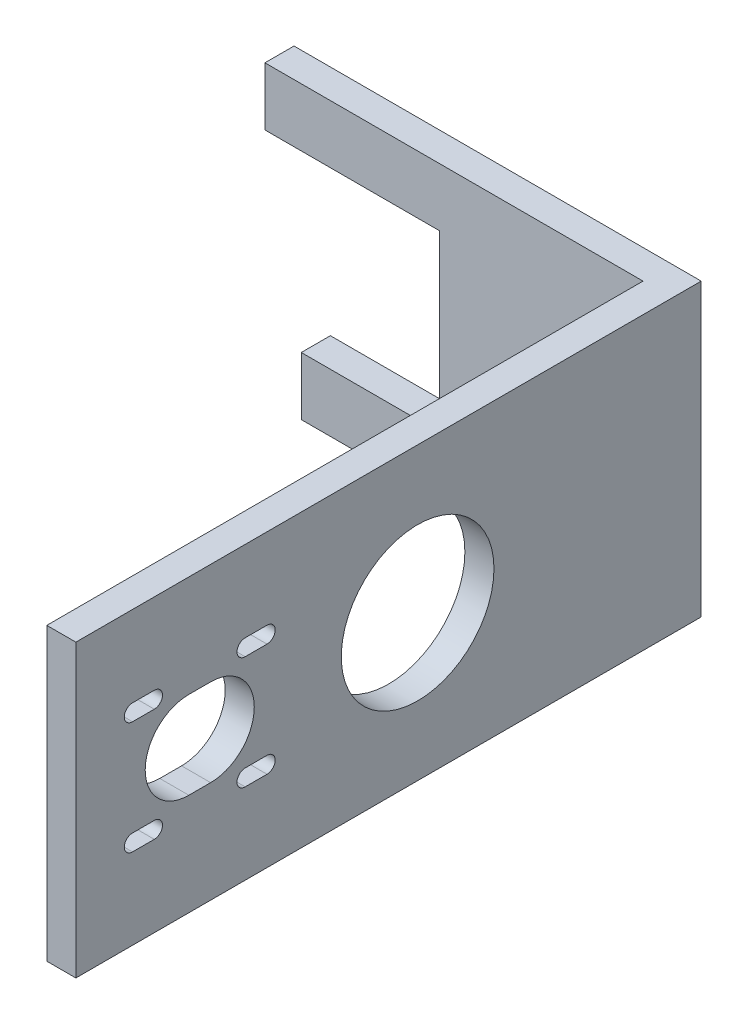
ISO-10303-21;
HEADER;
FILE_DESCRIPTION(('STEP AP214'),'2;1');
FILE_NAME('part.step','',(''),(''),'','','');
FILE_SCHEMA(('AUTOMOTIVE_DESIGN { 1 0 10303 214 1 1 1 1 }'));
ENDSEC;
DATA;
#1=APPLICATION_CONTEXT('core data for automotive mechanical design processes');
#2=APPLICATION_PROTOCOL_DEFINITION('international standard','automotive_design',2000,#1);
#3=PRODUCT_CONTEXT('',#1,'mechanical');
#4=PRODUCT('Part','Part','',(#3));
#5=PRODUCT_RELATED_PRODUCT_CATEGORY('part','',(#4));
#6=PRODUCT_DEFINITION_FORMATION('','',#4);
#7=PRODUCT_DEFINITION_CONTEXT('part definition',#1,'design');
#8=PRODUCT_DEFINITION('design','',#6,#7);
#9=PRODUCT_DEFINITION_SHAPE('','',#8);
#10=(LENGTH_UNIT() NAMED_UNIT(*) SI_UNIT(.MILLI.,.METRE.));
#11=(NAMED_UNIT(*) PLANE_ANGLE_UNIT() SI_UNIT($,.RADIAN.));
#12=(NAMED_UNIT(*) SI_UNIT($,.STERADIAN.) SOLID_ANGLE_UNIT());
#13=UNCERTAINTY_MEASURE_WITH_UNIT(LENGTH_MEASURE(1.E-05),#10,'distance_accuracy_value','');
#14=(GEOMETRIC_REPRESENTATION_CONTEXT(3) GLOBAL_UNCERTAINTY_ASSIGNED_CONTEXT((#13)) GLOBAL_UNIT_ASSIGNED_CONTEXT((#10,
#11,#12)) REPRESENTATION_CONTEXT('',''));
#15=CARTESIAN_POINT('',(0.,0.,0.));
#16=DIRECTION('',(0.,0.,1.));
#17=DIRECTION('',(1.,0.,0.));
#18=AXIS2_PLACEMENT_3D('',#15,#16,#17);
#19=CARTESIAN_POINT('',(0.,80.,0.002300000000105));
#20=DIRECTION('',(0.,0.,1.));
#21=DIRECTION('',(1.,0.,0.));
#22=AXIS2_PLACEMENT_3D('',#19,#20,#21);
#23=PLANE('',#22);
#24=CARTESIAN_POINT('',(95.,40.,0.002299999999991));
#25=DIRECTION('',(0.,0.,1.));
#26=DIRECTION('',(1.,0.,0.));
#27=AXIS2_PLACEMENT_3D('',#24,#25,#26);
#28=CIRCLE('',#27,3.3);
#29=CARTESIAN_POINT('',(98.3,40.,0.002299999999991));
#30=VERTEX_POINT('',#29);
#31=EDGE_CURVE('E335',#30,#30,#28,.T.);
#32=ORIENTED_EDGE('',*,*,#31,.T.);
#33=EDGE_LOOP('',(#32));
#34=FACE_BOUND('',#33,.T.);
#35=CARTESIAN_POINT('',(70.,40.,0.002299999999991));
#36=DIRECTION('',(0.,0.,1.));
#37=DIRECTION('',(1.,0.,0.));
#38=AXIS2_PLACEMENT_3D('',#35,#36,#37);
#39=CIRCLE('',#38,3.3);
#40=CARTESIAN_POINT('',(73.3,40.,0.002299999999991));
#41=VERTEX_POINT('',#40);
#42=EDGE_CURVE('E19',#41,#41,#39,.T.);
#43=ORIENTED_EDGE('',*,*,#42,.T.);
#44=EDGE_LOOP('',(#43));
#45=FACE_BOUND('',#44,.T.);
#46=DIRECTION('',(1.,0.,0.));
#47=VECTOR('',#46,1.);
#48=CARTESIAN_POINT('',(0.,16.,0.002299999999991));
#49=LINE('',#48,#47);
#50=CARTESIAN_POINT('',(10.,16.,0.002300000000048));
#51=VERTEX_POINT('',#50);
#52=CARTESIAN_POINT('',(48.,16.,0.002300000000048));
#53=VERTEX_POINT('',#52);
#54=EDGE_CURVE('E359',#51,#53,#49,.T.);
#55=ORIENTED_EDGE('',*,*,#54,.T.);
#56=DIRECTION('',(0.,1.,0.));
#57=VECTOR('',#56,1.);
#58=CARTESIAN_POINT('',(48.,64.,0.002299999999991));
#59=LINE('',#58,#57);
#60=CARTESIAN_POINT('',(48.,64.,0.002300000000048));
#61=VERTEX_POINT('',#60);
#62=EDGE_CURVE('E235',#53,#61,#59,.T.);
#63=ORIENTED_EDGE('',*,*,#62,.T.);
#64=DIRECTION('',(1.,0.,0.));
#65=VECTOR('',#64,1.);
#66=CARTESIAN_POINT('',(0.,64.,0.002299999999991));
#67=LINE('',#66,#65);
#68=CARTESIAN_POINT('',(0.,64.,0.0023000000000195));
#69=VERTEX_POINT('',#68);
#70=EDGE_CURVE('E213',#69,#61,#67,.T.);
#71=ORIENTED_EDGE('',*,*,#70,.F.);
#72=DIRECTION('',(0.,1.,0.));
#73=VECTOR('',#72,1.);
#74=CARTESIAN_POINT('',(0.,80.,0.002299999999991));
#75=LINE('',#74,#73);
#76=CARTESIAN_POINT('',(0.,80.,0.0023000000000195));
#77=VERTEX_POINT('',#76);
#78=EDGE_CURVE('E219',#69,#77,#75,.T.);
#79=ORIENTED_EDGE('',*,*,#78,.T.);
#80=DIRECTION('',(1.,0.,0.));
#81=VECTOR('',#80,1.);
#82=CARTESIAN_POINT('',(0.,80.,0.002299999999991));
#83=LINE('',#82,#81);
#84=CARTESIAN_POINT('',(112.,80.,0.002300000000048));
#85=VERTEX_POINT('',#84);
#86=EDGE_CURVE('E339',#77,#85,#83,.T.);
#87=ORIENTED_EDGE('',*,*,#86,.T.);
#88=DIRECTION('',(0.,1.,0.));
#89=VECTOR('',#88,1.);
#90=CARTESIAN_POINT('',(112.,80.,0.002299999999991));
#91=LINE('',#90,#89);
#92=CARTESIAN_POINT('',(112.,0.,0.002300000000048));
#93=VERTEX_POINT('',#92);
#94=EDGE_CURVE('E228',#93,#85,#91,.T.);
#95=ORIENTED_EDGE('',*,*,#94,.F.);
#96=DIRECTION('',(1.,0.,0.));
#97=VECTOR('',#96,1.);
#98=CARTESIAN_POINT('',(0.,0.,0.002299999999991));
#99=LINE('',#98,#97);
#100=CARTESIAN_POINT('',(10.,0.,0.0023000000000195));
#101=VERTEX_POINT('',#100);
#102=EDGE_CURVE('E378',#101,#93,#99,.T.);
#103=ORIENTED_EDGE('',*,*,#102,.F.);
#104=DIRECTION('',(0.,1.,0.));
#105=VECTOR('',#104,1.);
#106=CARTESIAN_POINT('',(10.,16.,0.002299999999991));
#107=LINE('',#106,#105);
#108=EDGE_CURVE('E346',#101,#51,#107,.T.);
#109=ORIENTED_EDGE('',*,*,#108,.T.);
#110=EDGE_LOOP('',(#55,#63,#71,#79,#87,#95,#103,#109));
#111=FACE_BOUND('',#110,.T.);
#112=ADVANCED_FACE('F16',(#34,#45,#111),#23,.F.);
#113=CARTESIAN_POINT('',(0.,80.,0.002300000000105));
#114=DIRECTION('',(1.,0.,0.));
#115=DIRECTION('',(0.,0.,-1.));
#116=AXIS2_PLACEMENT_3D('',#113,#114,#115);
#117=PLANE('',#116);
#118=DIRECTION('',(0.,1.,0.));
#119=VECTOR('',#118,1.);
#120=CARTESIAN_POINT('',(0.,80.,8.0023));
#121=LINE('',#120,#119);
#122=CARTESIAN_POINT('',(0.,80.,8.0023));
#123=VERTEX_POINT('',#122);
#124=CARTESIAN_POINT('',(0.,64.,8.0023));
#125=VERTEX_POINT('',#124);
#126=EDGE_CURVE('E370',#123,#125,#121,.F.);
#127=ORIENTED_EDGE('',*,*,#126,.F.);
#128=DIRECTION('',(0.,0.,-1.));
#129=VECTOR('',#128,1.);
#130=CARTESIAN_POINT('',(0.,80.,0.002300000000105));
#131=LINE('',#130,#129);
#132=EDGE_CURVE('E224',#123,#77,#131,.T.);
#133=ORIENTED_EDGE('',*,*,#132,.T.);
#134=ORIENTED_EDGE('',*,*,#78,.F.);
#135=DIRECTION('',(0.,0.,-1.));
#136=VECTOR('',#135,1.);
#137=CARTESIAN_POINT('',(0.,64.,0.002300000000105));
#138=LINE('',#137,#136);
#139=EDGE_CURVE('E222',#125,#69,#138,.T.);
#140=ORIENTED_EDGE('',*,*,#139,.F.);
#141=EDGE_LOOP('',(#127,#133,#134,#140));
#142=FACE_BOUND('',#141,.T.);
#143=ADVANCED_FACE('F221',(#142),#117,.F.);
#144=CARTESIAN_POINT('',(0.,64.,0.002300000000105));
#145=DIRECTION('',(0.,-1.,0.));
#146=DIRECTION('',(0.,0.,-1.));
#147=AXIS2_PLACEMENT_3D('',#144,#145,#146);
#148=PLANE('',#147);
#149=DIRECTION('',(0.,0.,-1.));
#150=VECTOR('',#149,1.);
#151=CARTESIAN_POINT('',(48.,64.,0.002300000000105));
#152=LINE('',#151,#150);
#153=CARTESIAN_POINT('',(48.,64.,8.0023));
#154=VERTEX_POINT('',#153);
#155=EDGE_CURVE('E237',#61,#154,#152,.F.);
#156=ORIENTED_EDGE('',*,*,#155,.T.);
#157=DIRECTION('',(1.,0.,0.));
#158=VECTOR('',#157,1.);
#159=CARTESIAN_POINT('',(0.,64.,8.0023));
#160=LINE('',#159,#158);
#161=EDGE_CURVE('E231',#125,#154,#160,.T.);
#162=ORIENTED_EDGE('',*,*,#161,.F.);
#163=ORIENTED_EDGE('',*,*,#139,.T.);
#164=ORIENTED_EDGE('',*,*,#70,.T.);
#165=EDGE_LOOP('',(#156,#162,#163,#164));
#166=FACE_BOUND('',#165,.T.);
#167=ADVANCED_FACE('F230',(#166),#148,.T.);
#168=CARTESIAN_POINT('',(48.,64.,0.002300000000105));
#169=DIRECTION('',(1.,0.,0.));
#170=DIRECTION('',(0.,0.,-1.));
#171=AXIS2_PLACEMENT_3D('',#168,#169,#170);
#172=PLANE('',#171);
#173=DIRECTION('',(0.,1.,0.));
#174=VECTOR('',#173,1.);
#175=CARTESIAN_POINT('',(48.,80.,8.0023));
#176=LINE('',#175,#174);
#177=CARTESIAN_POINT('',(48.,16.,8.0023));
#178=VERTEX_POINT('',#177);
#179=EDGE_CURVE('E362',#154,#178,#176,.F.);
#180=ORIENTED_EDGE('',*,*,#179,.F.);
#181=ORIENTED_EDGE('',*,*,#155,.F.);
#182=ORIENTED_EDGE('',*,*,#62,.F.);
#183=DIRECTION('',(0.,0.,-1.));
#184=VECTOR('',#183,1.);
#185=CARTESIAN_POINT('',(48.,16.,0.002300000000105));
#186=LINE('',#185,#184);
#187=EDGE_CURVE('E353',#53,#178,#186,.F.);
#188=ORIENTED_EDGE('',*,*,#187,.T.);
#189=EDGE_LOOP('',(#180,#181,#182,#188));
#190=FACE_BOUND('',#189,.T.);
#191=ADVANCED_FACE('F363',(#190),#172,.F.);
#192=CARTESIAN_POINT('',(0.,16.,0.002300000000105));
#193=DIRECTION('',(0.,-1.,0.));
#194=DIRECTION('',(0.,0.,-1.));
#195=AXIS2_PLACEMENT_3D('',#192,#193,#194);
#196=PLANE('',#195);
#197=ORIENTED_EDGE('',*,*,#187,.F.);
#198=ORIENTED_EDGE('',*,*,#54,.F.);
#199=DIRECTION('',(0.,0.,-1.));
#200=VECTOR('',#199,1.);
#201=CARTESIAN_POINT('',(10.,16.,0.002300000000105));
#202=LINE('',#201,#200);
#203=CARTESIAN_POINT('',(10.,16.,8.0023));
#204=VERTEX_POINT('',#203);
#205=EDGE_CURVE('E342',#51,#204,#202,.F.);
#206=ORIENTED_EDGE('',*,*,#205,.T.);
#207=DIRECTION('',(1.,0.,0.));
#208=VECTOR('',#207,1.);
#209=CARTESIAN_POINT('',(0.,16.,8.0023));
#210=LINE('',#209,#208);
#211=EDGE_CURVE('E366',#178,#204,#210,.F.);
#212=ORIENTED_EDGE('',*,*,#211,.F.);
#213=EDGE_LOOP('',(#197,#198,#206,#212));
#214=FACE_BOUND('',#213,.T.);
#215=ADVANCED_FACE('F620',(#214),#196,.F.);
#216=CARTESIAN_POINT('',(10.,16.,0.002300000000105));
#217=DIRECTION('',(1.,0.,0.));
#218=DIRECTION('',(0.,0.,-1.));
#219=AXIS2_PLACEMENT_3D('',#216,#217,#218);
#220=PLANE('',#219);
#221=DIRECTION('',(0.,1.,0.));
#222=VECTOR('',#221,1.);
#223=CARTESIAN_POINT('',(10.,80.,8.0023));
#224=LINE('',#223,#222);
#225=CARTESIAN_POINT('',(10.,0.,8.0023));
#226=VERTEX_POINT('',#225);
#227=EDGE_CURVE('E368',#204,#226,#224,.F.);
#228=ORIENTED_EDGE('',*,*,#227,.F.);
#229=ORIENTED_EDGE('',*,*,#205,.F.);
#230=ORIENTED_EDGE('',*,*,#108,.F.);
#231=DIRECTION('',(0.,0.,-1.));
#232=VECTOR('',#231,1.);
#233=CARTESIAN_POINT('',(10.,0.,0.002300000000105));
#234=LINE('',#233,#232);
#235=EDGE_CURVE('E401',#226,#101,#234,.T.);
#236=ORIENTED_EDGE('',*,*,#235,.F.);
#237=EDGE_LOOP('',(#228,#229,#230,#236));
#238=FACE_BOUND('',#237,.T.);
#239=ADVANCED_FACE('F423',(#238),#220,.F.);
#240=CARTESIAN_POINT('',(70.,40.,0.002300000000105));
#241=DIRECTION('',(0.,0.,1.));
#242=DIRECTION('',(1.,0.,0.));
#243=AXIS2_PLACEMENT_3D('',#240,#241,#242);
#244=CYLINDRICAL_SURFACE('',#243,3.3);
#245=ORIENTED_EDGE('',*,*,#42,.F.);
#246=EDGE_LOOP('',(#245));
#247=FACE_BOUND('',#246,.T.);
#248=CARTESIAN_POINT('',(70.,40.,8.0023));
#249=DIRECTION('',(0.,0.,1.));
#250=DIRECTION('',(1.,0.,0.));
#251=AXIS2_PLACEMENT_3D('',#248,#249,#250);
#252=CIRCLE('',#251,3.3);
#253=CARTESIAN_POINT('',(73.3,40.,8.0023));
#254=VERTEX_POINT('',#253);
#255=EDGE_CURVE('E332',#254,#254,#252,.F.);
#256=ORIENTED_EDGE('',*,*,#255,.F.);
#257=EDGE_LOOP('',(#256));
#258=FACE_BOUND('',#257,.T.);
#259=ADVANCED_FACE('F613',(#247,#258),#244,.F.);
#260=CARTESIAN_POINT('',(95.,40.,0.002300000000105));
#261=DIRECTION('',(0.,0.,1.));
#262=DIRECTION('',(1.,0.,0.));
#263=AXIS2_PLACEMENT_3D('',#260,#261,#262);
#264=CYLINDRICAL_SURFACE('',#263,3.3);
#265=ORIENTED_EDGE('',*,*,#31,.F.);
#266=EDGE_LOOP('',(#265));
#267=FACE_BOUND('',#266,.T.);
#268=CARTESIAN_POINT('',(95.,40.,8.0023));
#269=DIRECTION('',(0.,0.,1.));
#270=DIRECTION('',(1.,0.,0.));
#271=AXIS2_PLACEMENT_3D('',#268,#269,#270);
#272=CIRCLE('',#271,3.3);
#273=CARTESIAN_POINT('',(98.3,40.,8.0023));
#274=VERTEX_POINT('',#273);
#275=EDGE_CURVE('E328',#274,#274,#272,.F.);
#276=ORIENTED_EDGE('',*,*,#275,.F.);
#277=EDGE_LOOP('',(#276));
#278=FACE_BOUND('',#277,.T.);
#279=ADVANCED_FACE('F609',(#267,#278),#264,.F.);
#280=CARTESIAN_POINT('',(112.,80.,8.0023));
#281=DIRECTION('',(1.,0.,0.));
#282=DIRECTION('',(0.,0.,-1.));
#283=AXIS2_PLACEMENT_3D('',#280,#281,#282);
#284=PLANE('',#283);
#285=DIRECTION('',(0.,0.,-1.));
#286=VECTOR('',#285,1.);
#287=CARTESIAN_POINT('',(112.,22.25,156.43254977401));
#288=LINE('',#287,#286);
#289=CARTESIAN_POINT('',(112.,22.25,150.43254977401));
#290=VERTEX_POINT('',#289);
#291=CARTESIAN_POINT('',(112.,22.25,156.43254977401));
#292=VERTEX_POINT('',#291);
#293=EDGE_CURVE('E379',#290,#292,#288,.F.);
#294=ORIENTED_EDGE('',*,*,#293,.T.);
#295=CARTESIAN_POINT('',(112.,24.5,156.43254977401));
#296=DIRECTION('',(1.,0.,0.));
#297=DIRECTION('',(0.,0.,-1.));
#298=AXIS2_PLACEMENT_3D('',#295,#296,#297);
#299=CIRCLE('',#298,2.25);
#300=CARTESIAN_POINT('',(112.,26.75,156.43254977401));
#301=VERTEX_POINT('',#300);
#302=EDGE_CURVE('E282',#292,#301,#299,.F.);
#303=ORIENTED_EDGE('',*,*,#302,.T.);
#304=DIRECTION('',(0.,0.,1.));
#305=VECTOR('',#304,1.);
#306=CARTESIAN_POINT('',(112.,26.75,150.43254977401));
#307=LINE('',#306,#305);
#308=CARTESIAN_POINT('',(112.,26.75,150.43254977401));
#309=VERTEX_POINT('',#308);
#310=EDGE_CURVE('E293',#301,#309,#307,.F.);
#311=ORIENTED_EDGE('',*,*,#310,.T.);
#312=CARTESIAN_POINT('',(112.,24.5,150.43254977401));
#313=DIRECTION('',(1.,0.,0.));
#314=DIRECTION('',(0.,0.,-1.));
#315=AXIS2_PLACEMENT_3D('',#312,#313,#314);
#316=CIRCLE('',#315,2.25);
#317=EDGE_CURVE('E286',#309,#290,#316,.F.);
#318=ORIENTED_EDGE('',*,*,#317,.T.);
#319=EDGE_LOOP('',(#294,#303,#311,#318));
#320=FACE_BOUND('',#319,.T.);
#321=DIRECTION('',(0.,0.,-1.));
#322=VECTOR('',#321,1.);
#323=CARTESIAN_POINT('',(112.,22.25,125.43254977401));
#324=LINE('',#323,#322);
#325=CARTESIAN_POINT('',(112.,22.25,119.43254977401));
#326=VERTEX_POINT('',#325);
#327=CARTESIAN_POINT('',(112.,22.25,125.43254977401));
#328=VERTEX_POINT('',#327);
#329=EDGE_CURVE('E383',#326,#328,#324,.F.);
#330=ORIENTED_EDGE('',*,*,#329,.T.);
#331=CARTESIAN_POINT('',(112.,24.5,125.43254977401));
#332=DIRECTION('',(1.,0.,0.));
#333=DIRECTION('',(0.,0.,-1.));
#334=AXIS2_PLACEMENT_3D('',#331,#332,#333);
#335=CIRCLE('',#334,2.25);
#336=CARTESIAN_POINT('',(112.,26.75,125.43254977401));
#337=VERTEX_POINT('',#336);
#338=EDGE_CURVE('E290',#328,#337,#335,.F.);
#339=ORIENTED_EDGE('',*,*,#338,.T.);
#340=DIRECTION('',(0.,0.,1.));
#341=VECTOR('',#340,1.);
#342=CARTESIAN_POINT('',(112.,26.75,119.43254977401));
#343=LINE('',#342,#341);
#344=CARTESIAN_POINT('',(112.,26.75,119.43254977401));
#345=VERTEX_POINT('',#344);
#346=EDGE_CURVE('E302',#337,#345,#343,.F.);
#347=ORIENTED_EDGE('',*,*,#346,.T.);
#348=CARTESIAN_POINT('',(112.,24.5,119.43254977401));
#349=DIRECTION('',(1.,0.,0.));
#350=DIRECTION('',(0.,0.,-1.));
#351=AXIS2_PLACEMENT_3D('',#348,#349,#350);
#352=CIRCLE('',#351,2.25);
#353=EDGE_CURVE('E295',#345,#326,#352,.F.);
#354=ORIENTED_EDGE('',*,*,#353,.T.);
#355=EDGE_LOOP('',(#330,#339,#347,#354));
#356=FACE_BOUND('',#355,.T.);
#357=DIRECTION('',(0.,0.,-1.));
#358=VECTOR('',#357,1.);
#359=CARTESIAN_POINT('',(112.,28.,140.93254977401));
#360=LINE('',#359,#358);
#361=CARTESIAN_POINT('',(112.,28.,134.93254977401));
#362=VERTEX_POINT('',#361);
#363=CARTESIAN_POINT('',(112.,28.,140.93254977401));
#364=VERTEX_POINT('',#363);
#365=EDGE_CURVE('E387',#362,#364,#360,.F.);
#366=ORIENTED_EDGE('',*,*,#365,.T.);
#367=CARTESIAN_POINT('',(112.,40.,140.93254977401));
#368=DIRECTION('',(1.,0.,0.));
#369=DIRECTION('',(0.,0.,-1.));
#370=AXIS2_PLACEMENT_3D('',#367,#368,#369);
#371=CIRCLE('',#370,12.);
#372=CARTESIAN_POINT('',(112.,52.,140.93254977401));
#373=VERTEX_POINT('',#372);
#374=EDGE_CURVE('E299',#364,#373,#371,.F.);
#375=ORIENTED_EDGE('',*,*,#374,.T.);
#376=DIRECTION('',(0.,0.,1.));
#377=VECTOR('',#376,1.);
#378=CARTESIAN_POINT('',(112.,52.,134.93254977401));
#379=LINE('',#378,#377);
#380=CARTESIAN_POINT('',(112.,52.,134.93254977401));
#381=VERTEX_POINT('',#380);
#382=EDGE_CURVE('E311',#373,#381,#379,.F.);
#383=ORIENTED_EDGE('',*,*,#382,.T.);
#384=CARTESIAN_POINT('',(112.,40.,134.93254977401));
#385=DIRECTION('',(1.,0.,0.));
#386=DIRECTION('',(0.,0.,-1.));
#387=AXIS2_PLACEMENT_3D('',#384,#385,#386);
#388=CIRCLE('',#387,12.);
#389=EDGE_CURVE('E304',#381,#362,#388,.F.);
#390=ORIENTED_EDGE('',*,*,#389,.T.);
#391=EDGE_LOOP('',(#366,#375,#383,#390));
#392=FACE_BOUND('',#391,.T.);
#393=CARTESIAN_POINT('',(112.,40.,78.0023));
#394=DIRECTION('',(1.,0.,0.));
#395=DIRECTION('',(0.,0.,-1.));
#396=AXIS2_PLACEMENT_3D('',#393,#394,#395);
#397=CIRCLE('',#396,21.);
#398=CARTESIAN_POINT('',(112.,40.,57.0023));
#399=VERTEX_POINT('',#398);
#400=EDGE_CURVE('E308',#399,#399,#397,.F.);
#401=ORIENTED_EDGE('',*,*,#400,.T.);
#402=EDGE_LOOP('',(#401));
#403=FACE_BOUND('',#402,.T.);
#404=DIRECTION('',(0.,0.,-1.));
#405=VECTOR('',#404,1.);
#406=CARTESIAN_POINT('',(112.,53.25,156.43254977401));
#407=LINE('',#406,#405);
#408=CARTESIAN_POINT('',(112.,53.25,150.43254977401));
#409=VERTEX_POINT('',#408);
#410=CARTESIAN_POINT('',(112.,53.25,156.43254977401));
#411=VERTEX_POINT('',#410);
#412=EDGE_CURVE('E391',#409,#411,#407,.F.);
#413=ORIENTED_EDGE('',*,*,#412,.T.);
#414=CARTESIAN_POINT('',(112.,55.5,156.43254977401));
#415=DIRECTION('',(1.,0.,0.));
#416=DIRECTION('',(0.,0.,-1.));
#417=AXIS2_PLACEMENT_3D('',#414,#415,#416);
#418=CIRCLE('',#417,2.25);
#419=CARTESIAN_POINT('',(112.,57.75,156.43254977401));
#420=VERTEX_POINT('',#419);
#421=EDGE_CURVE('E312',#411,#420,#418,.F.);
#422=ORIENTED_EDGE('',*,*,#421,.T.);
#423=DIRECTION('',(0.,0.,1.));
#424=VECTOR('',#423,1.);
#425=CARTESIAN_POINT('',(112.,57.75,150.43254977401));
#426=LINE('',#425,#424);
#427=CARTESIAN_POINT('',(112.,57.75,150.43254977401));
#428=VERTEX_POINT('',#427);
#429=EDGE_CURVE('E322',#420,#428,#426,.F.);
#430=ORIENTED_EDGE('',*,*,#429,.T.);
#431=CARTESIAN_POINT('',(112.,55.5,150.43254977401));
#432=DIRECTION('',(1.,0.,0.));
#433=DIRECTION('',(0.,0.,-1.));
#434=AXIS2_PLACEMENT_3D('',#431,#432,#433);
#435=CIRCLE('',#434,2.25);
#436=EDGE_CURVE('E316',#428,#409,#435,.F.);
#437=ORIENTED_EDGE('',*,*,#436,.T.);
#438=EDGE_LOOP('',(#413,#422,#430,#437));
#439=FACE_BOUND('',#438,.T.);
#440=DIRECTION('',(0.,0.,-1.));
#441=VECTOR('',#440,1.);
#442=CARTESIAN_POINT('',(112.,53.25,125.43254977401));
#443=LINE('',#442,#441);
#444=CARTESIAN_POINT('',(112.,53.25,119.43254977401));
#445=VERTEX_POINT('',#444);
#446=CARTESIAN_POINT('',(112.,53.25,125.43254977401));
#447=VERTEX_POINT('',#446);
#448=EDGE_CURVE('E395',#445,#447,#443,.F.);
#449=ORIENTED_EDGE('',*,*,#448,.T.);
#450=CARTESIAN_POINT('',(112.,55.5,125.43254977401));
#451=DIRECTION('',(1.,0.,0.));
#452=DIRECTION('',(0.,0.,-1.));
#453=AXIS2_PLACEMENT_3D('',#450,#451,#452);
#454=CIRCLE('',#453,2.25);
#455=CARTESIAN_POINT('',(112.,57.75,125.43254977401));
#456=VERTEX_POINT('',#455);
#457=EDGE_CURVE('E320',#447,#456,#454,.F.);
#458=ORIENTED_EDGE('',*,*,#457,.T.);
#459=DIRECTION('',(0.,0.,1.));
#460=VECTOR('',#459,1.);
#461=CARTESIAN_POINT('',(112.,57.75,119.43254977401));
#462=LINE('',#461,#460);
#463=CARTESIAN_POINT('',(112.,57.75,119.43254977401));
#464=VERTEX_POINT('',#463);
#465=EDGE_CURVE('E156',#456,#464,#462,.F.);
#466=ORIENTED_EDGE('',*,*,#465,.T.);
#467=CARTESIAN_POINT('',(112.,55.5,119.43254977401));
#468=DIRECTION('',(1.,0.,0.));
#469=DIRECTION('',(0.,0.,-1.));
#470=AXIS2_PLACEMENT_3D('',#467,#468,#469);
#471=CIRCLE('',#470,2.25);
#472=EDGE_CURVE('E324',#464,#445,#471,.F.);
#473=ORIENTED_EDGE('',*,*,#472,.T.);
#474=EDGE_LOOP('',(#449,#458,#466,#473));
#475=FACE_BOUND('',#474,.T.);
#476=DIRECTION('',(0.,1.,0.));
#477=VECTOR('',#476,1.);
#478=CARTESIAN_POINT('',(112.,80.,172.0023));
#479=LINE('',#478,#477);
#480=CARTESIAN_POINT('',(112.,0.,172.0023));
#481=VERTEX_POINT('',#480);
#482=CARTESIAN_POINT('',(112.,80.,172.0023));
#483=VERTEX_POINT('',#482);
#484=EDGE_CURVE('E416',#481,#483,#479,.T.);
#485=ORIENTED_EDGE('',*,*,#484,.F.);
#486=DIRECTION('',(0.,0.,-1.));
#487=VECTOR('',#486,1.);
#488=CARTESIAN_POINT('',(112.,0.,8.0023));
#489=LINE('',#488,#487);
#490=EDGE_CURVE('E165',#93,#481,#489,.F.);
#491=ORIENTED_EDGE('',*,*,#490,.F.);
#492=ORIENTED_EDGE('',*,*,#94,.T.);
#493=DIRECTION('',(0.,0.,-1.));
#494=VECTOR('',#493,1.);
#495=CARTESIAN_POINT('',(112.,80.,8.0023));
#496=LINE('',#495,#494);
#497=EDGE_CURVE('E331',#85,#483,#496,.F.);
#498=ORIENTED_EDGE('',*,*,#497,.T.);
#499=EDGE_LOOP('',(#485,#491,#492,#498));
#500=FACE_BOUND('',#499,.T.);
#501=ADVANCED_FACE('F415',(#320,#356,#392,#403,#439,#475,#500),#284,.T.);
#502=CARTESIAN_POINT('',(0.,80.,8.0023));
#503=DIRECTION('',(0.,0.,1.));
#504=DIRECTION('',(1.,0.,0.));
#505=AXIS2_PLACEMENT_3D('',#502,#503,#504);
#506=PLANE('',#505);
#507=ORIENTED_EDGE('',*,*,#275,.T.);
#508=EDGE_LOOP('',(#507));
#509=FACE_BOUND('',#508,.T.);
#510=ORIENTED_EDGE('',*,*,#255,.T.);
#511=EDGE_LOOP('',(#510));
#512=FACE_BOUND('',#511,.T.);
#513=DIRECTION('',(1.,0.,0.));
#514=VECTOR('',#513,1.);
#515=CARTESIAN_POINT('',(0.,0.,8.0023));
#516=LINE('',#515,#514);
#517=CARTESIAN_POINT('',(104.,0.,8.0023));
#518=VERTEX_POINT('',#517);
#519=EDGE_CURVE('E334',#226,#518,#516,.T.);
#520=ORIENTED_EDGE('',*,*,#519,.T.);
#521=DIRECTION('',(0.,1.,0.));
#522=VECTOR('',#521,1.);
#523=CARTESIAN_POINT('',(104.,80.,8.0023));
#524=LINE('',#523,#522);
#525=CARTESIAN_POINT('',(104.,80.,8.0023));
#526=VERTEX_POINT('',#525);
#527=EDGE_CURVE('E285',#518,#526,#524,.T.);
#528=ORIENTED_EDGE('',*,*,#527,.T.);
#529=DIRECTION('',(1.,0.,0.));
#530=VECTOR('',#529,1.);
#531=CARTESIAN_POINT('',(0.,80.,8.0023));
#532=LINE('',#531,#530);
#533=EDGE_CURVE('E375',#526,#123,#532,.F.);
#534=ORIENTED_EDGE('',*,*,#533,.T.);
#535=ORIENTED_EDGE('',*,*,#126,.T.);
#536=ORIENTED_EDGE('',*,*,#161,.T.);
#537=ORIENTED_EDGE('',*,*,#179,.T.);
#538=ORIENTED_EDGE('',*,*,#211,.T.);
#539=ORIENTED_EDGE('',*,*,#227,.T.);
#540=EDGE_LOOP('',(#520,#528,#534,#535,#536,#537,#538,#539));
#541=FACE_BOUND('',#540,.T.);
#542=ADVANCED_FACE('F603',(#509,#512,#541),#506,.T.);
#543=CARTESIAN_POINT('',(104.,80.,8.0023));
#544=DIRECTION('',(0.,-1.,0.));
#545=DIRECTION('',(0.,0.,-1.));
#546=AXIS2_PLACEMENT_3D('',#543,#544,#545);
#547=PLANE('',#546);
#548=ORIENTED_EDGE('',*,*,#497,.F.);
#549=ORIENTED_EDGE('',*,*,#86,.F.);
#550=ORIENTED_EDGE('',*,*,#132,.F.);
#551=ORIENTED_EDGE('',*,*,#533,.F.);
#552=DIRECTION('',(0.,0.,-1.));
#553=VECTOR('',#552,1.);
#554=CARTESIAN_POINT('',(104.,80.,8.0023));
#555=LINE('',#554,#553);
#556=CARTESIAN_POINT('',(104.,80.,172.0023));
#557=VERTEX_POINT('',#556);
#558=EDGE_CURVE('E471',#526,#557,#555,.F.);
#559=ORIENTED_EDGE('',*,*,#558,.T.);
#560=DIRECTION('',(1.,0.,0.));
#561=VECTOR('',#560,1.);
#562=CARTESIAN_POINT('',(104.,80.,172.0023));
#563=LINE('',#562,#561);
#564=EDGE_CURVE('E411',#483,#557,#563,.F.);
#565=ORIENTED_EDGE('',*,*,#564,.F.);
#566=EDGE_LOOP('',(#548,#549,#550,#551,#559,#565));
#567=FACE_BOUND('',#566,.T.);
#568=ADVANCED_FACE('F406',(#567),#547,.F.);
#569=CARTESIAN_POINT('',(104.,80.,172.0023));
#570=DIRECTION('',(0.,0.,1.));
#571=DIRECTION('',(1.,0.,0.));
#572=AXIS2_PLACEMENT_3D('',#569,#570,#571);
#573=PLANE('',#572);
#574=DIRECTION('',(1.,0.,0.));
#575=VECTOR('',#574,1.);
#576=CARTESIAN_POINT('',(104.,0.,172.0023));
#577=LINE('',#576,#575);
#578=CARTESIAN_POINT('',(104.,0.,172.0023));
#579=VERTEX_POINT('',#578);
#580=EDGE_CURVE('E399',#481,#579,#577,.F.);
#581=ORIENTED_EDGE('',*,*,#580,.F.);
#582=ORIENTED_EDGE('',*,*,#484,.T.);
#583=ORIENTED_EDGE('',*,*,#564,.T.);
#584=DIRECTION('',(0.,1.,0.));
#585=VECTOR('',#584,1.);
#586=CARTESIAN_POINT('',(104.,80.,172.0023));
#587=LINE('',#586,#585);
#588=EDGE_CURVE('E473',#557,#579,#587,.F.);
#589=ORIENTED_EDGE('',*,*,#588,.T.);
#590=EDGE_LOOP('',(#581,#582,#583,#589));
#591=FACE_BOUND('',#590,.T.);
#592=ADVANCED_FACE('F597',(#591),#573,.T.);
#593=CARTESIAN_POINT('',(104.,0.,8.0023));
#594=DIRECTION('',(0.,-1.,0.));
#595=DIRECTION('',(0.,0.,-1.));
#596=AXIS2_PLACEMENT_3D('',#593,#594,#595);
#597=PLANE('',#596);
#598=ORIENTED_EDGE('',*,*,#490,.T.);
#599=ORIENTED_EDGE('',*,*,#580,.T.);
#600=DIRECTION('',(0.,0.,-1.));
#601=VECTOR('',#600,1.);
#602=CARTESIAN_POINT('',(104.,0.,8.0023));
#603=LINE('',#602,#601);
#604=EDGE_CURVE('E476',#579,#518,#603,.T.);
#605=ORIENTED_EDGE('',*,*,#604,.T.);
#606=ORIENTED_EDGE('',*,*,#519,.F.);
#607=ORIENTED_EDGE('',*,*,#235,.T.);
#608=ORIENTED_EDGE('',*,*,#102,.T.);
#609=EDGE_LOOP('',(#598,#599,#605,#606,#607,#608));
#610=FACE_BOUND('',#609,.T.);
#611=ADVANCED_FACE('F419',(#610),#597,.T.);
#612=CARTESIAN_POINT('',(112.,57.75,119.43254977401));
#613=DIRECTION('',(0.,1.,0.));
#614=DIRECTION('',(0.,0.,1.));
#615=AXIS2_PLACEMENT_3D('',#612,#613,#614);
#616=PLANE('',#615);
#617=DIRECTION('',(1.,0.,0.));
#618=VECTOR('',#617,1.);
#619=CARTESIAN_POINT('',(112.,57.75,125.43254977401));
#620=LINE('',#619,#618);
#621=CARTESIAN_POINT('',(104.,57.75,125.43254977401));
#622=VERTEX_POINT('',#621);
#623=EDGE_CURVE('E397',#456,#622,#620,.F.);
#624=ORIENTED_EDGE('',*,*,#623,.T.);
#625=DIRECTION('',(0.,0.,-1.));
#626=VECTOR('',#625,1.);
#627=CARTESIAN_POINT('',(104.,57.75,8.0023));
#628=LINE('',#627,#626);
#629=CARTESIAN_POINT('',(104.,57.75,119.43254977401));
#630=VERTEX_POINT('',#629);
#631=EDGE_CURVE('E281',#622,#630,#628,.T.);
#632=ORIENTED_EDGE('',*,*,#631,.T.);
#633=DIRECTION('',(1.,0.,0.));
#634=VECTOR('',#633,1.);
#635=CARTESIAN_POINT('',(112.,57.75,119.43254977401));
#636=LINE('',#635,#634);
#637=EDGE_CURVE('E327',#630,#464,#636,.T.);
#638=ORIENTED_EDGE('',*,*,#637,.T.);
#639=ORIENTED_EDGE('',*,*,#465,.F.);
#640=EDGE_LOOP('',(#624,#632,#638,#639));
#641=FACE_BOUND('',#640,.T.);
#642=ADVANCED_FACE('F590',(#641),#616,.F.);
#643=CARTESIAN_POINT('',(112.,55.5,119.43254977401));
#644=DIRECTION('',(1.,0.,0.));
#645=DIRECTION('',(0.,0.,-1.));
#646=AXIS2_PLACEMENT_3D('',#643,#644,#645);
#647=CYLINDRICAL_SURFACE('',#646,2.25);
#648=ORIENTED_EDGE('',*,*,#637,.F.);
#649=CARTESIAN_POINT('',(104.,55.5,119.43254977401));
#650=DIRECTION('',(1.,0.,0.));
#651=DIRECTION('',(0.,0.,-1.));
#652=AXIS2_PLACEMENT_3D('',#649,#650,#651);
#653=CIRCLE('',#652,2.25);
#654=CARTESIAN_POINT('',(104.,53.25,119.43254977401));
#655=VERTEX_POINT('',#654);
#656=EDGE_CURVE('E278',#630,#655,#653,.F.);
#657=ORIENTED_EDGE('',*,*,#656,.T.);
#658=DIRECTION('',(1.,0.,0.));
#659=VECTOR('',#658,1.);
#660=CARTESIAN_POINT('',(112.,53.25,119.43254977401));
#661=LINE('',#660,#659);
#662=EDGE_CURVE('E326',#655,#445,#661,.T.);
#663=ORIENTED_EDGE('',*,*,#662,.T.);
#664=ORIENTED_EDGE('',*,*,#472,.F.);
#665=EDGE_LOOP('',(#648,#657,#663,#664));
#666=FACE_BOUND('',#665,.T.);
#667=ADVANCED_FACE('F586',(#666),#647,.F.);
#668=CARTESIAN_POINT('',(112.,53.25,125.43254977401));
#669=DIRECTION('',(0.,-1.,0.));
#670=DIRECTION('',(0.,0.,-1.));
#671=AXIS2_PLACEMENT_3D('',#668,#669,#670);
#672=PLANE('',#671);
#673=ORIENTED_EDGE('',*,*,#662,.F.);
#674=DIRECTION('',(0.,0.,-1.));
#675=VECTOR('',#674,1.);
#676=CARTESIAN_POINT('',(104.,53.25,8.0023));
#677=LINE('',#676,#675);
#678=CARTESIAN_POINT('',(104.,53.25,125.43254977401));
#679=VERTEX_POINT('',#678);
#680=EDGE_CURVE('E277',#655,#679,#677,.F.);
#681=ORIENTED_EDGE('',*,*,#680,.T.);
#682=DIRECTION('',(1.,0.,0.));
#683=VECTOR('',#682,1.);
#684=CARTESIAN_POINT('',(112.,53.25,125.43254977401));
#685=LINE('',#684,#683);
#686=EDGE_CURVE('E323',#679,#447,#685,.T.);
#687=ORIENTED_EDGE('',*,*,#686,.T.);
#688=ORIENTED_EDGE('',*,*,#448,.F.);
#689=EDGE_LOOP('',(#673,#681,#687,#688));
#690=FACE_BOUND('',#689,.T.);
#691=ADVANCED_FACE('F582',(#690),#672,.F.);
#692=CARTESIAN_POINT('',(112.,55.5,125.43254977401));
#693=DIRECTION('',(1.,0.,0.));
#694=DIRECTION('',(0.,0.,-1.));
#695=AXIS2_PLACEMENT_3D('',#692,#693,#694);
#696=CYLINDRICAL_SURFACE('',#695,2.25);
#697=ORIENTED_EDGE('',*,*,#686,.F.);
#698=CARTESIAN_POINT('',(104.,55.5,125.43254977401));
#699=DIRECTION('',(1.,0.,0.));
#700=DIRECTION('',(0.,0.,-1.));
#701=AXIS2_PLACEMENT_3D('',#698,#699,#700);
#702=CIRCLE('',#701,2.25);
#703=EDGE_CURVE('E274',#679,#622,#702,.F.);
#704=ORIENTED_EDGE('',*,*,#703,.T.);
#705=ORIENTED_EDGE('',*,*,#623,.F.);
#706=ORIENTED_EDGE('',*,*,#457,.F.);
#707=EDGE_LOOP('',(#697,#704,#705,#706));
#708=FACE_BOUND('',#707,.T.);
#709=ADVANCED_FACE('F578',(#708),#696,.F.);
#710=CARTESIAN_POINT('',(112.,57.75,150.43254977401));
#711=DIRECTION('',(0.,1.,0.));
#712=DIRECTION('',(0.,0.,1.));
#713=AXIS2_PLACEMENT_3D('',#710,#711,#712);
#714=PLANE('',#713);
#715=DIRECTION('',(1.,0.,0.));
#716=VECTOR('',#715,1.);
#717=CARTESIAN_POINT('',(112.,57.75,156.43254977401));
#718=LINE('',#717,#716);
#719=CARTESIAN_POINT('',(104.,57.75,156.43254977401));
#720=VERTEX_POINT('',#719);
#721=EDGE_CURVE('E393',#420,#720,#718,.F.);
#722=ORIENTED_EDGE('',*,*,#721,.T.);
#723=DIRECTION('',(0.,0.,-1.));
#724=VECTOR('',#723,1.);
#725=CARTESIAN_POINT('',(104.,57.75,8.0023));
#726=LINE('',#725,#724);
#727=CARTESIAN_POINT('',(104.,57.75,150.43254977401));
#728=VERTEX_POINT('',#727);
#729=EDGE_CURVE('E273',#720,#728,#726,.T.);
#730=ORIENTED_EDGE('',*,*,#729,.T.);
#731=DIRECTION('',(1.,0.,0.));
#732=VECTOR('',#731,1.);
#733=CARTESIAN_POINT('',(112.,57.75,150.43254977401));
#734=LINE('',#733,#732);
#735=EDGE_CURVE('E319',#728,#428,#734,.T.);
#736=ORIENTED_EDGE('',*,*,#735,.T.);
#737=ORIENTED_EDGE('',*,*,#429,.F.);
#738=EDGE_LOOP('',(#722,#730,#736,#737));
#739=FACE_BOUND('',#738,.T.);
#740=ADVANCED_FACE('F574',(#739),#714,.F.);
#741=CARTESIAN_POINT('',(112.,55.5,150.43254977401));
#742=DIRECTION('',(1.,0.,0.));
#743=DIRECTION('',(0.,0.,-1.));
#744=AXIS2_PLACEMENT_3D('',#741,#742,#743);
#745=CYLINDRICAL_SURFACE('',#744,2.25);
#746=ORIENTED_EDGE('',*,*,#735,.F.);
#747=CARTESIAN_POINT('',(104.,55.5,150.43254977401));
#748=DIRECTION('',(1.,0.,0.));
#749=DIRECTION('',(0.,0.,-1.));
#750=AXIS2_PLACEMENT_3D('',#747,#748,#749);
#751=CIRCLE('',#750,2.25);
#752=CARTESIAN_POINT('',(104.,53.25,150.43254977401));
#753=VERTEX_POINT('',#752);
#754=EDGE_CURVE('E270',#728,#753,#751,.F.);
#755=ORIENTED_EDGE('',*,*,#754,.T.);
#756=DIRECTION('',(1.,0.,0.));
#757=VECTOR('',#756,1.);
#758=CARTESIAN_POINT('',(112.,53.25,150.43254977401));
#759=LINE('',#758,#757);
#760=EDGE_CURVE('E318',#753,#409,#759,.T.);
#761=ORIENTED_EDGE('',*,*,#760,.T.);
#762=ORIENTED_EDGE('',*,*,#436,.F.);
#763=EDGE_LOOP('',(#746,#755,#761,#762));
#764=FACE_BOUND('',#763,.T.);
#765=ADVANCED_FACE('F570',(#764),#745,.F.);
#766=CARTESIAN_POINT('',(112.,53.25,156.43254977401));
#767=DIRECTION('',(0.,-1.,0.));
#768=DIRECTION('',(0.,0.,-1.));
#769=AXIS2_PLACEMENT_3D('',#766,#767,#768);
#770=PLANE('',#769);
#771=ORIENTED_EDGE('',*,*,#760,.F.);
#772=DIRECTION('',(0.,0.,-1.));
#773=VECTOR('',#772,1.);
#774=CARTESIAN_POINT('',(104.,53.25,8.0023));
#775=LINE('',#774,#773);
#776=CARTESIAN_POINT('',(104.,53.25,156.43254977401));
#777=VERTEX_POINT('',#776);
#778=EDGE_CURVE('E269',#753,#777,#775,.F.);
#779=ORIENTED_EDGE('',*,*,#778,.T.);
#780=DIRECTION('',(1.,0.,0.));
#781=VECTOR('',#780,1.);
#782=CARTESIAN_POINT('',(112.,53.25,156.43254977401));
#783=LINE('',#782,#781);
#784=EDGE_CURVE('E315',#777,#411,#783,.T.);
#785=ORIENTED_EDGE('',*,*,#784,.T.);
#786=ORIENTED_EDGE('',*,*,#412,.F.);
#787=EDGE_LOOP('',(#771,#779,#785,#786));
#788=FACE_BOUND('',#787,.T.);
#789=ADVANCED_FACE('F566',(#788),#770,.F.);
#790=CARTESIAN_POINT('',(112.,55.5,156.43254977401));
#791=DIRECTION('',(1.,0.,0.));
#792=DIRECTION('',(0.,0.,-1.));
#793=AXIS2_PLACEMENT_3D('',#790,#791,#792);
#794=CYLINDRICAL_SURFACE('',#793,2.25);
#795=ORIENTED_EDGE('',*,*,#784,.F.);
#796=CARTESIAN_POINT('',(104.,55.5,156.43254977401));
#797=DIRECTION('',(1.,0.,0.));
#798=DIRECTION('',(0.,0.,-1.));
#799=AXIS2_PLACEMENT_3D('',#796,#797,#798);
#800=CIRCLE('',#799,2.25);
#801=EDGE_CURVE('E266',#777,#720,#800,.F.);
#802=ORIENTED_EDGE('',*,*,#801,.T.);
#803=ORIENTED_EDGE('',*,*,#721,.F.);
#804=ORIENTED_EDGE('',*,*,#421,.F.);
#805=EDGE_LOOP('',(#795,#802,#803,#804));
#806=FACE_BOUND('',#805,.T.);
#807=ADVANCED_FACE('F562',(#806),#794,.F.);
#808=CARTESIAN_POINT('',(104.,40.,78.0023));
#809=DIRECTION('',(1.,0.,0.));
#810=DIRECTION('',(0.,0.,-1.));
#811=AXIS2_PLACEMENT_3D('',#808,#809,#810);
#812=CYLINDRICAL_SURFACE('',#811,21.);
#813=CARTESIAN_POINT('',(104.,40.,78.0023));
#814=DIRECTION('',(1.,0.,0.));
#815=DIRECTION('',(0.,0.,-1.));
#816=AXIS2_PLACEMENT_3D('',#813,#814,#815);
#817=CIRCLE('',#816,21.);
#818=CARTESIAN_POINT('',(104.,40.,57.0023));
#819=VERTEX_POINT('',#818);
#820=EDGE_CURVE('E263',#819,#819,#817,.F.);
#821=ORIENTED_EDGE('',*,*,#820,.T.);
#822=EDGE_LOOP('',(#821));
#823=FACE_BOUND('',#822,.T.);
#824=ORIENTED_EDGE('',*,*,#400,.F.);
#825=EDGE_LOOP('',(#824));
#826=FACE_BOUND('',#825,.T.);
#827=ADVANCED_FACE('F558',(#823,#826),#812,.F.);
#828=CARTESIAN_POINT('',(112.,52.,134.93254977401));
#829=DIRECTION('',(0.,1.,0.));
#830=DIRECTION('',(0.,0.,1.));
#831=AXIS2_PLACEMENT_3D('',#828,#829,#830);
#832=PLANE('',#831);
#833=DIRECTION('',(1.,0.,0.));
#834=VECTOR('',#833,1.);
#835=CARTESIAN_POINT('',(112.,52.,140.93254977401));
#836=LINE('',#835,#834);
#837=CARTESIAN_POINT('',(104.,52.,140.93254977401));
#838=VERTEX_POINT('',#837);
#839=EDGE_CURVE('E389',#373,#838,#836,.F.);
#840=ORIENTED_EDGE('',*,*,#839,.T.);
#841=DIRECTION('',(0.,0.,-1.));
#842=VECTOR('',#841,1.);
#843=CARTESIAN_POINT('',(104.,52.,8.0023));
#844=LINE('',#843,#842);
#845=CARTESIAN_POINT('',(104.,52.,134.93254977401));
#846=VERTEX_POINT('',#845);
#847=EDGE_CURVE('E262',#838,#846,#844,.T.);
#848=ORIENTED_EDGE('',*,*,#847,.T.);
#849=DIRECTION('',(1.,0.,0.));
#850=VECTOR('',#849,1.);
#851=CARTESIAN_POINT('',(112.,52.,134.93254977401));
#852=LINE('',#851,#850);
#853=EDGE_CURVE('E307',#846,#381,#852,.T.);
#854=ORIENTED_EDGE('',*,*,#853,.T.);
#855=ORIENTED_EDGE('',*,*,#382,.F.);
#856=EDGE_LOOP('',(#840,#848,#854,#855));
#857=FACE_BOUND('',#856,.T.);
#858=ADVANCED_FACE('F554',(#857),#832,.F.);
#859=CARTESIAN_POINT('',(112.,40.,134.93254977401));
#860=DIRECTION('',(1.,0.,0.));
#861=DIRECTION('',(0.,0.,-1.));
#862=AXIS2_PLACEMENT_3D('',#859,#860,#861);
#863=CYLINDRICAL_SURFACE('',#862,12.);
#864=ORIENTED_EDGE('',*,*,#853,.F.);
#865=CARTESIAN_POINT('',(104.,40.,134.93254977401));
#866=DIRECTION('',(1.,0.,0.));
#867=DIRECTION('',(0.,0.,-1.));
#868=AXIS2_PLACEMENT_3D('',#865,#866,#867);
#869=CIRCLE('',#868,12.);
#870=CARTESIAN_POINT('',(104.,28.,134.93254977401));
#871=VERTEX_POINT('',#870);
#872=EDGE_CURVE('E259',#846,#871,#869,.F.);
#873=ORIENTED_EDGE('',*,*,#872,.T.);
#874=DIRECTION('',(1.,0.,0.));
#875=VECTOR('',#874,1.);
#876=CARTESIAN_POINT('',(112.,28.,134.93254977401));
#877=LINE('',#876,#875);
#878=EDGE_CURVE('E306',#871,#362,#877,.T.);
#879=ORIENTED_EDGE('',*,*,#878,.T.);
#880=ORIENTED_EDGE('',*,*,#389,.F.);
#881=EDGE_LOOP('',(#864,#873,#879,#880));
#882=FACE_BOUND('',#881,.T.);
#883=ADVANCED_FACE('F550',(#882),#863,.F.);
#884=CARTESIAN_POINT('',(112.,28.,140.93254977401));
#885=DIRECTION('',(0.,-1.,0.));
#886=DIRECTION('',(0.,0.,-1.));
#887=AXIS2_PLACEMENT_3D('',#884,#885,#886);
#888=PLANE('',#887);
#889=ORIENTED_EDGE('',*,*,#878,.F.);
#890=DIRECTION('',(0.,0.,-1.));
#891=VECTOR('',#890,1.);
#892=CARTESIAN_POINT('',(104.,28.,8.0023));
#893=LINE('',#892,#891);
#894=CARTESIAN_POINT('',(104.,28.,140.93254977401));
#895=VERTEX_POINT('',#894);
#896=EDGE_CURVE('E258',#871,#895,#893,.F.);
#897=ORIENTED_EDGE('',*,*,#896,.T.);
#898=DIRECTION('',(1.,0.,0.));
#899=VECTOR('',#898,1.);
#900=CARTESIAN_POINT('',(112.,28.,140.93254977401));
#901=LINE('',#900,#899);
#902=EDGE_CURVE('E303',#895,#364,#901,.T.);
#903=ORIENTED_EDGE('',*,*,#902,.T.);
#904=ORIENTED_EDGE('',*,*,#365,.F.);
#905=EDGE_LOOP('',(#889,#897,#903,#904));
#906=FACE_BOUND('',#905,.T.);
#907=ADVANCED_FACE('F546',(#906),#888,.F.);
#908=CARTESIAN_POINT('',(112.,40.,140.93254977401));
#909=DIRECTION('',(1.,0.,0.));
#910=DIRECTION('',(0.,0.,-1.));
#911=AXIS2_PLACEMENT_3D('',#908,#909,#910);
#912=CYLINDRICAL_SURFACE('',#911,12.);
#913=ORIENTED_EDGE('',*,*,#902,.F.);
#914=CARTESIAN_POINT('',(104.,40.,140.93254977401));
#915=DIRECTION('',(1.,0.,0.));
#916=DIRECTION('',(0.,0.,-1.));
#917=AXIS2_PLACEMENT_3D('',#914,#915,#916);
#918=CIRCLE('',#917,12.);
#919=EDGE_CURVE('E255',#895,#838,#918,.F.);
#920=ORIENTED_EDGE('',*,*,#919,.T.);
#921=ORIENTED_EDGE('',*,*,#839,.F.);
#922=ORIENTED_EDGE('',*,*,#374,.F.);
#923=EDGE_LOOP('',(#913,#920,#921,#922));
#924=FACE_BOUND('',#923,.T.);
#925=ADVANCED_FACE('F542',(#924),#912,.F.);
#926=CARTESIAN_POINT('',(112.,26.75,119.43254977401));
#927=DIRECTION('',(0.,1.,0.));
#928=DIRECTION('',(0.,0.,1.));
#929=AXIS2_PLACEMENT_3D('',#926,#927,#928);
#930=PLANE('',#929);
#931=DIRECTION('',(1.,0.,0.));
#932=VECTOR('',#931,1.);
#933=CARTESIAN_POINT('',(112.,26.75,125.43254977401));
#934=LINE('',#933,#932);
#935=CARTESIAN_POINT('',(104.,26.75,125.43254977401));
#936=VERTEX_POINT('',#935);
#937=EDGE_CURVE('E385',#337,#936,#934,.F.);
#938=ORIENTED_EDGE('',*,*,#937,.T.);
#939=DIRECTION('',(0.,0.,-1.));
#940=VECTOR('',#939,1.);
#941=CARTESIAN_POINT('',(104.,26.75,8.0023));
#942=LINE('',#941,#940);
#943=CARTESIAN_POINT('',(104.,26.75,119.43254977401));
#944=VERTEX_POINT('',#943);
#945=EDGE_CURVE('E254',#936,#944,#942,.T.);
#946=ORIENTED_EDGE('',*,*,#945,.T.);
#947=DIRECTION('',(1.,0.,0.));
#948=VECTOR('',#947,1.);
#949=CARTESIAN_POINT('',(112.,26.75,119.43254977401));
#950=LINE('',#949,#948);
#951=EDGE_CURVE('E298',#944,#345,#950,.T.);
#952=ORIENTED_EDGE('',*,*,#951,.T.);
#953=ORIENTED_EDGE('',*,*,#346,.F.);
#954=EDGE_LOOP('',(#938,#946,#952,#953));
#955=FACE_BOUND('',#954,.T.);
#956=ADVANCED_FACE('F538',(#955),#930,.F.);
#957=CARTESIAN_POINT('',(112.,24.5,119.43254977401));
#958=DIRECTION('',(1.,0.,0.));
#959=DIRECTION('',(0.,0.,-1.));
#960=AXIS2_PLACEMENT_3D('',#957,#958,#959);
#961=CYLINDRICAL_SURFACE('',#960,2.25);
#962=ORIENTED_EDGE('',*,*,#951,.F.);
#963=CARTESIAN_POINT('',(104.,24.5,119.43254977401));
#964=DIRECTION('',(1.,0.,0.));
#965=DIRECTION('',(0.,0.,-1.));
#966=AXIS2_PLACEMENT_3D('',#963,#964,#965);
#967=CIRCLE('',#966,2.25);
#968=CARTESIAN_POINT('',(104.,22.25,119.43254977401));
#969=VERTEX_POINT('',#968);
#970=EDGE_CURVE('E251',#944,#969,#967,.F.);
#971=ORIENTED_EDGE('',*,*,#970,.T.);
#972=DIRECTION('',(1.,0.,0.));
#973=VECTOR('',#972,1.);
#974=CARTESIAN_POINT('',(112.,22.25,119.43254977401));
#975=LINE('',#974,#973);
#976=EDGE_CURVE('E297',#969,#326,#975,.T.);
#977=ORIENTED_EDGE('',*,*,#976,.T.);
#978=ORIENTED_EDGE('',*,*,#353,.F.);
#979=EDGE_LOOP('',(#962,#971,#977,#978));
#980=FACE_BOUND('',#979,.T.);
#981=ADVANCED_FACE('F534',(#980),#961,.F.);
#982=CARTESIAN_POINT('',(112.,22.25,125.43254977401));
#983=DIRECTION('',(0.,-1.,0.));
#984=DIRECTION('',(0.,0.,-1.));
#985=AXIS2_PLACEMENT_3D('',#982,#983,#984);
#986=PLANE('',#985);
#987=ORIENTED_EDGE('',*,*,#976,.F.);
#988=DIRECTION('',(0.,0.,-1.));
#989=VECTOR('',#988,1.);
#990=CARTESIAN_POINT('',(104.,22.25,8.0023));
#991=LINE('',#990,#989);
#992=CARTESIAN_POINT('',(104.,22.25,125.43254977401));
#993=VERTEX_POINT('',#992);
#994=EDGE_CURVE('E250',#969,#993,#991,.F.);
#995=ORIENTED_EDGE('',*,*,#994,.T.);
#996=DIRECTION('',(1.,0.,0.));
#997=VECTOR('',#996,1.);
#998=CARTESIAN_POINT('',(112.,22.25,125.43254977401));
#999=LINE('',#998,#997);
#1000=EDGE_CURVE('E294',#993,#328,#999,.T.);
#1001=ORIENTED_EDGE('',*,*,#1000,.T.);
#1002=ORIENTED_EDGE('',*,*,#329,.F.);
#1003=EDGE_LOOP('',(#987,#995,#1001,#1002));
#1004=FACE_BOUND('',#1003,.T.);
#1005=ADVANCED_FACE('F530',(#1004),#986,.F.);
#1006=CARTESIAN_POINT('',(112.,24.5,125.43254977401));
#1007=DIRECTION('',(1.,0.,0.));
#1008=DIRECTION('',(0.,0.,-1.));
#1009=AXIS2_PLACEMENT_3D('',#1006,#1007,#1008);
#1010=CYLINDRICAL_SURFACE('',#1009,2.25);
#1011=ORIENTED_EDGE('',*,*,#1000,.F.);
#1012=CARTESIAN_POINT('',(104.,24.5,125.43254977401));
#1013=DIRECTION('',(1.,0.,0.));
#1014=DIRECTION('',(0.,0.,-1.));
#1015=AXIS2_PLACEMENT_3D('',#1012,#1013,#1014);
#1016=CIRCLE('',#1015,2.25);
#1017=EDGE_CURVE('E247',#993,#936,#1016,.F.);
#1018=ORIENTED_EDGE('',*,*,#1017,.T.);
#1019=ORIENTED_EDGE('',*,*,#937,.F.);
#1020=ORIENTED_EDGE('',*,*,#338,.F.);
#1021=EDGE_LOOP('',(#1011,#1018,#1019,#1020));
#1022=FACE_BOUND('',#1021,.T.);
#1023=ADVANCED_FACE('F527',(#1022),#1010,.F.);
#1024=CARTESIAN_POINT('',(112.,26.75,150.43254977401));
#1025=DIRECTION('',(0.,1.,0.));
#1026=DIRECTION('',(0.,0.,1.));
#1027=AXIS2_PLACEMENT_3D('',#1024,#1025,#1026);
#1028=PLANE('',#1027);
#1029=DIRECTION('',(1.,0.,0.));
#1030=VECTOR('',#1029,1.);
#1031=CARTESIAN_POINT('',(112.,26.75,156.43254977401));
#1032=LINE('',#1031,#1030);
#1033=CARTESIAN_POINT('',(104.,26.75,156.43254977401));
#1034=VERTEX_POINT('',#1033);
#1035=EDGE_CURVE('E381',#301,#1034,#1032,.F.);
#1036=ORIENTED_EDGE('',*,*,#1035,.T.);
#1037=DIRECTION('',(0.,0.,-1.));
#1038=VECTOR('',#1037,1.);
#1039=CARTESIAN_POINT('',(104.,26.75,8.0023));
#1040=LINE('',#1039,#1038);
#1041=CARTESIAN_POINT('',(104.,26.75,150.43254977401));
#1042=VERTEX_POINT('',#1041);
#1043=EDGE_CURVE('E246',#1034,#1042,#1040,.T.);
#1044=ORIENTED_EDGE('',*,*,#1043,.T.);
#1045=DIRECTION('',(1.,0.,0.));
#1046=VECTOR('',#1045,1.);
#1047=CARTESIAN_POINT('',(112.,26.75,150.43254977401));
#1048=LINE('',#1047,#1046);
#1049=EDGE_CURVE('E289',#1042,#309,#1048,.T.);
#1050=ORIENTED_EDGE('',*,*,#1049,.T.);
#1051=ORIENTED_EDGE('',*,*,#310,.F.);
#1052=EDGE_LOOP('',(#1036,#1044,#1050,#1051));
#1053=FACE_BOUND('',#1052,.T.);
#1054=ADVANCED_FACE('F510',(#1053),#1028,.F.);
#1055=CARTESIAN_POINT('',(112.,24.5,150.43254977401));
#1056=DIRECTION('',(1.,0.,0.));
#1057=DIRECTION('',(0.,0.,-1.));
#1058=AXIS2_PLACEMENT_3D('',#1055,#1056,#1057);
#1059=CYLINDRICAL_SURFACE('',#1058,2.25);
#1060=ORIENTED_EDGE('',*,*,#1049,.F.);
#1061=CARTESIAN_POINT('',(104.,24.5,150.43254977401));
#1062=DIRECTION('',(1.,0.,0.));
#1063=DIRECTION('',(0.,0.,-1.));
#1064=AXIS2_PLACEMENT_3D('',#1061,#1062,#1063);
#1065=CIRCLE('',#1064,2.25);
#1066=CARTESIAN_POINT('',(104.,22.25,150.43254977401));
#1067=VERTEX_POINT('',#1066);
#1068=EDGE_CURVE('E243',#1042,#1067,#1065,.F.);
#1069=ORIENTED_EDGE('',*,*,#1068,.T.);
#1070=DIRECTION('',(1.,0.,0.));
#1071=VECTOR('',#1070,1.);
#1072=CARTESIAN_POINT('',(112.,22.25,150.43254977401));
#1073=LINE('',#1072,#1071);
#1074=EDGE_CURVE('E288',#1067,#290,#1073,.T.);
#1075=ORIENTED_EDGE('',*,*,#1074,.T.);
#1076=ORIENTED_EDGE('',*,*,#317,.F.);
#1077=EDGE_LOOP('',(#1060,#1069,#1075,#1076));
#1078=FACE_BOUND('',#1077,.T.);
#1079=ADVANCED_FACE('F507',(#1078),#1059,.F.);
#1080=CARTESIAN_POINT('',(112.,22.25,156.43254977401));
#1081=DIRECTION('',(0.,-1.,0.));
#1082=DIRECTION('',(0.,0.,-1.));
#1083=AXIS2_PLACEMENT_3D('',#1080,#1081,#1082);
#1084=PLANE('',#1083);
#1085=ORIENTED_EDGE('',*,*,#1074,.F.);
#1086=DIRECTION('',(0.,0.,-1.));
#1087=VECTOR('',#1086,1.);
#1088=CARTESIAN_POINT('',(104.,22.25,8.0023));
#1089=LINE('',#1088,#1087);
#1090=CARTESIAN_POINT('',(104.,22.25,156.43254977401));
#1091=VERTEX_POINT('',#1090);
#1092=EDGE_CURVE('E25',#1067,#1091,#1089,.F.);
#1093=ORIENTED_EDGE('',*,*,#1092,.T.);
#1094=DIRECTION('',(1.,0.,0.));
#1095=VECTOR('',#1094,1.);
#1096=CARTESIAN_POINT('',(112.,22.25,156.43254977401));
#1097=LINE('',#1096,#1095);
#1098=EDGE_CURVE('E33',#1091,#292,#1097,.T.);
#1099=ORIENTED_EDGE('',*,*,#1098,.T.);
#1100=ORIENTED_EDGE('',*,*,#293,.F.);
#1101=EDGE_LOOP('',(#1085,#1093,#1099,#1100));
#1102=FACE_BOUND('',#1101,.T.);
#1103=ADVANCED_FACE('F500',(#1102),#1084,.F.);
#1104=CARTESIAN_POINT('',(112.,24.5,156.43254977401));
#1105=DIRECTION('',(1.,0.,0.));
#1106=DIRECTION('',(0.,0.,-1.));
#1107=AXIS2_PLACEMENT_3D('',#1104,#1105,#1106);
#1108=CYLINDRICAL_SURFACE('',#1107,2.25);
#1109=ORIENTED_EDGE('',*,*,#1098,.F.);
#1110=CARTESIAN_POINT('',(104.,24.5,156.43254977401));
#1111=DIRECTION('',(1.,0.,0.));
#1112=DIRECTION('',(0.,0.,-1.));
#1113=AXIS2_PLACEMENT_3D('',#1110,#1111,#1112);
#1114=CIRCLE('',#1113,2.25);
#1115=EDGE_CURVE('E11',#1091,#1034,#1114,.F.);
#1116=ORIENTED_EDGE('',*,*,#1115,.T.);
#1117=ORIENTED_EDGE('',*,*,#1035,.F.);
#1118=ORIENTED_EDGE('',*,*,#302,.F.);
#1119=EDGE_LOOP('',(#1109,#1116,#1117,#1118));
#1120=FACE_BOUND('',#1119,.T.);
#1121=ADVANCED_FACE('F512',(#1120),#1108,.F.);
#1122=CARTESIAN_POINT('',(104.,80.,8.0023));
#1123=DIRECTION('',(1.,0.,0.));
#1124=DIRECTION('',(0.,0.,-1.));
#1125=AXIS2_PLACEMENT_3D('',#1122,#1123,#1124);
#1126=PLANE('',#1125);
#1127=ORIENTED_EDGE('',*,*,#1092,.F.);
#1128=ORIENTED_EDGE('',*,*,#1068,.F.);
#1129=ORIENTED_EDGE('',*,*,#1043,.F.);
#1130=ORIENTED_EDGE('',*,*,#1115,.F.);
#1131=EDGE_LOOP('',(#1127,#1128,#1129,#1130));
#1132=FACE_BOUND('',#1131,.T.);
#1133=ORIENTED_EDGE('',*,*,#994,.F.);
#1134=ORIENTED_EDGE('',*,*,#970,.F.);
#1135=ORIENTED_EDGE('',*,*,#945,.F.);
#1136=ORIENTED_EDGE('',*,*,#1017,.F.);
#1137=EDGE_LOOP('',(#1133,#1134,#1135,#1136));
#1138=FACE_BOUND('',#1137,.T.);
#1139=ORIENTED_EDGE('',*,*,#896,.F.);
#1140=ORIENTED_EDGE('',*,*,#872,.F.);
#1141=ORIENTED_EDGE('',*,*,#847,.F.);
#1142=ORIENTED_EDGE('',*,*,#919,.F.);
#1143=EDGE_LOOP('',(#1139,#1140,#1141,#1142));
#1144=FACE_BOUND('',#1143,.T.);
#1145=ORIENTED_EDGE('',*,*,#820,.F.);
#1146=EDGE_LOOP('',(#1145));
#1147=FACE_BOUND('',#1146,.T.);
#1148=ORIENTED_EDGE('',*,*,#778,.F.);
#1149=ORIENTED_EDGE('',*,*,#754,.F.);
#1150=ORIENTED_EDGE('',*,*,#729,.F.);
#1151=ORIENTED_EDGE('',*,*,#801,.F.);
#1152=EDGE_LOOP('',(#1148,#1149,#1150,#1151));
#1153=FACE_BOUND('',#1152,.T.);
#1154=ORIENTED_EDGE('',*,*,#680,.F.);
#1155=ORIENTED_EDGE('',*,*,#656,.F.);
#1156=ORIENTED_EDGE('',*,*,#631,.F.);
#1157=ORIENTED_EDGE('',*,*,#703,.F.);
#1158=EDGE_LOOP('',(#1154,#1155,#1156,#1157));
#1159=FACE_BOUND('',#1158,.T.);
#1160=ORIENTED_EDGE('',*,*,#588,.F.);
#1161=ORIENTED_EDGE('',*,*,#558,.F.);
#1162=ORIENTED_EDGE('',*,*,#527,.F.);
#1163=ORIENTED_EDGE('',*,*,#604,.F.);
#1164=EDGE_LOOP('',(#1160,#1161,#1162,#1163));
#1165=FACE_BOUND('',#1164,.T.);
#1166=ADVANCED_FACE('F504',(#1132,#1138,#1144,#1147,#1153,#1159,#1165),#1126,.F.);
#1167=CLOSED_SHELL('',(#112,#143,#167,#191,#215,#239,#259,#279,#501,#542,#568,#592,#611,#642,
#667,#691,#709,#740,#765,#789,#807,#827,#858,#883,#907,#925,#956,#981,#1005,#1023,#1054,#1079,
#1103,#1121,#1166));
#1168=MANIFOLD_SOLID_BREP('B1',#1167);
#1169=ADVANCED_BREP_SHAPE_REPRESENTATION('',(#18,#1168),#14);
#1170=SHAPE_DEFINITION_REPRESENTATION(#9,#1169);
ENDSEC;
END-ISO-10303-21;
